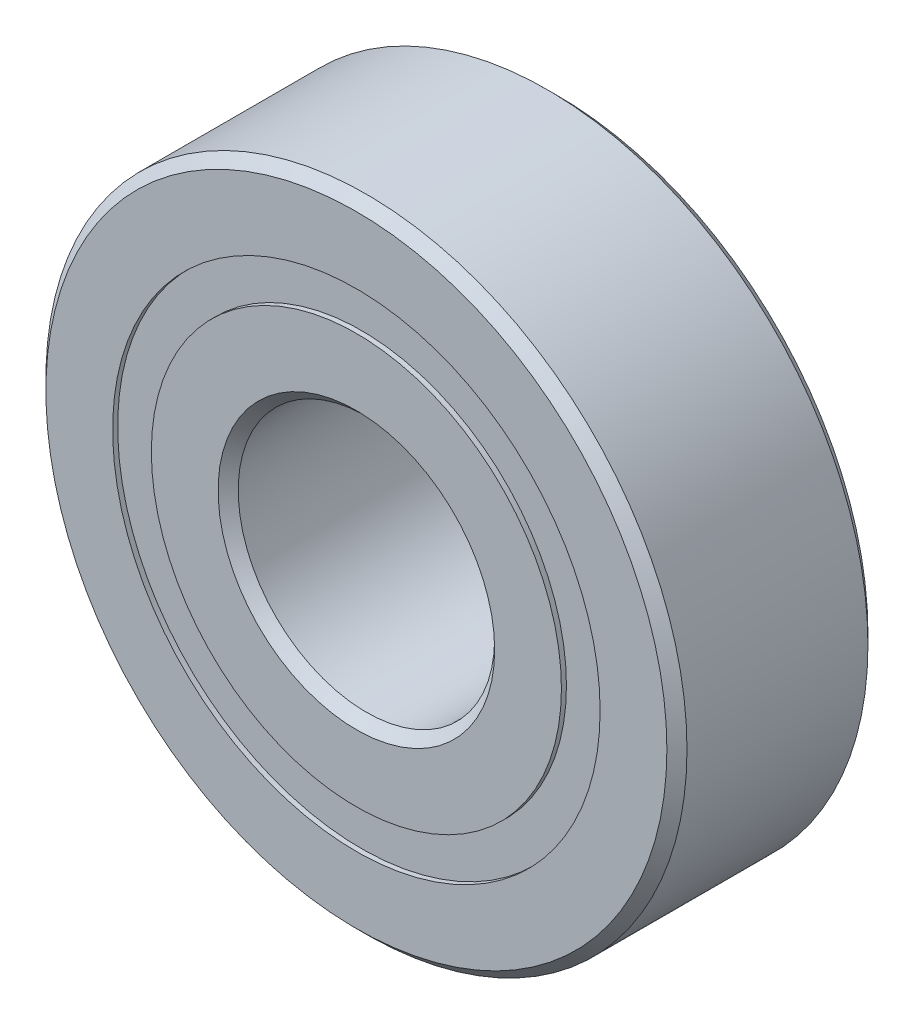
ISO-10303-21;
HEADER;
FILE_DESCRIPTION(('STEP AP214'),'2;1');
FILE_NAME('part.step','',(''),(''),'','','');
FILE_SCHEMA(('AUTOMOTIVE_DESIGN { 1 0 10303 214 1 1 1 1 }'));
ENDSEC;
DATA;
#1=APPLICATION_CONTEXT('core data for automotive mechanical design processes');
#2=APPLICATION_PROTOCOL_DEFINITION('international standard','automotive_design',2000,#1);
#3=PRODUCT_CONTEXT('',#1,'mechanical');
#4=PRODUCT('Part','Part','',(#3));
#5=PRODUCT_RELATED_PRODUCT_CATEGORY('part','',(#4));
#6=PRODUCT_DEFINITION_FORMATION('','',#4);
#7=PRODUCT_DEFINITION_CONTEXT('part definition',#1,'design');
#8=PRODUCT_DEFINITION('design','',#6,#7);
#9=PRODUCT_DEFINITION_SHAPE('','',#8);
#10=(LENGTH_UNIT() NAMED_UNIT(*) SI_UNIT(.MILLI.,.METRE.));
#11=(NAMED_UNIT(*) PLANE_ANGLE_UNIT() SI_UNIT($,.RADIAN.));
#12=(NAMED_UNIT(*) SI_UNIT($,.STERADIAN.) SOLID_ANGLE_UNIT());
#13=UNCERTAINTY_MEASURE_WITH_UNIT(LENGTH_MEASURE(1.E-05),#10,'distance_accuracy_value','');
#14=(GEOMETRIC_REPRESENTATION_CONTEXT(3) GLOBAL_UNCERTAINTY_ASSIGNED_CONTEXT((#13)) GLOBAL_UNIT_ASSIGNED_CONTEXT((#10,
#11,#12)) REPRESENTATION_CONTEXT('',''));
#15=CARTESIAN_POINT('',(0.,0.,0.));
#16=DIRECTION('',(0.,0.,1.));
#17=DIRECTION('',(1.,0.,0.));
#18=AXIS2_PLACEMENT_3D('',#15,#16,#17);
#19=CARTESIAN_POINT('',(0.,6.03522142857143,-2.36474));
#20=DIRECTION('',(0.,0.,1.));
#21=DIRECTION('',(1.,0.,0.));
#22=AXIS2_PLACEMENT_3D('',#19,#20,#21);
#23=PLANE('',#22);
#24=CARTESIAN_POINT('',(0.,0.,-2.36474));
#25=DIRECTION('',(0.,0.,1.));
#26=DIRECTION('',(1.,0.,0.));
#27=AXIS2_PLACEMENT_3D('',#24,#25,#26);
#28=CIRCLE('',#27,6.03522142857143);
#29=CARTESIAN_POINT('',(6.03522142857143,0.,-2.36474));
#30=VERTEX_POINT('',#29);
#31=EDGE_CURVE('E57',#30,#30,#28,.T.);
#32=ORIENTED_EDGE('',*,*,#31,.F.);
#33=EDGE_LOOP('',(#32));
#34=FACE_BOUND('',#33,.T.);
#35=CARTESIAN_POINT('',(0.,0.,-2.36474));
#36=DIRECTION('',(0.,0.,1.));
#37=DIRECTION('',(1.,0.,0.));
#38=AXIS2_PLACEMENT_3D('',#35,#36,#37);
#39=CIRCLE('',#38,5.07727857142857);
#40=CARTESIAN_POINT('',(5.07727857142857,0.,-2.36474));
#41=VERTEX_POINT('',#40);
#42=EDGE_CURVE('E11',#41,#41,#39,.T.);
#43=ORIENTED_EDGE('',*,*,#42,.T.);
#44=EDGE_LOOP('',(#43));
#45=FACE_BOUND('',#44,.T.);
#46=ADVANCED_FACE('F43',(#34,#45),#23,.F.);
#47=CARTESIAN_POINT('',(0.,0.,2.4892));
#48=DIRECTION('',(0.,0.,1.));
#49=DIRECTION('',(1.,0.,0.));
#50=AXIS2_PLACEMENT_3D('',#47,#48,#49);
#51=CYLINDRICAL_SURFACE('',#50,5.07727857142857);
#52=ORIENTED_EDGE('',*,*,#42,.F.);
#53=EDGE_LOOP('',(#52));
#54=FACE_BOUND('',#53,.T.);
#55=CARTESIAN_POINT('',(0.,0.,-1.20554465033679));
#56=DIRECTION('',(0.,0.,1.));
#57=DIRECTION('',(1.,0.,0.));
#58=AXIS2_PLACEMENT_3D('',#55,#56,#57);
#59=CIRCLE('',#58,5.07727857142857);
#60=CARTESIAN_POINT('',(5.07727857142857,0.,-1.20554465033679));
#61=VERTEX_POINT('',#60);
#62=EDGE_CURVE('E49',#61,#61,#59,.T.);
#63=ORIENTED_EDGE('',*,*,#62,.T.);
#64=EDGE_LOOP('',(#63));
#65=FACE_BOUND('',#64,.T.);
#66=ADVANCED_FACE('F66',(#54,#65),#51,.F.);
#67=CARTESIAN_POINT('',(0.,6.03522142857143,-1.20554465033679));
#68=DIRECTION('',(0.,0.,-1.));
#69=DIRECTION('',(-1.,0.,0.));
#70=AXIS2_PLACEMENT_3D('',#67,#68,#69);
#71=PLANE('',#70);
#72=ORIENTED_EDGE('',*,*,#62,.F.);
#73=EDGE_LOOP('',(#72));
#74=FACE_BOUND('',#73,.T.);
#75=CARTESIAN_POINT('',(0.,0.,-1.20554465033679));
#76=DIRECTION('',(0.,0.,1.));
#77=DIRECTION('',(1.,0.,0.));
#78=AXIS2_PLACEMENT_3D('',#75,#76,#77);
#79=CIRCLE('',#78,6.03522142857143);
#80=CARTESIAN_POINT('',(6.03522142857143,0.,-1.20554465033679));
#81=VERTEX_POINT('',#80);
#82=EDGE_CURVE('E53',#81,#81,#79,.T.);
#83=ORIENTED_EDGE('',*,*,#82,.T.);
#84=EDGE_LOOP('',(#83));
#85=FACE_BOUND('',#84,.T.);
#86=ADVANCED_FACE('F70',(#74,#85),#71,.F.);
#87=CARTESIAN_POINT('',(0.,0.,2.4892));
#88=DIRECTION('',(0.,0.,1.));
#89=DIRECTION('',(1.,0.,0.));
#90=AXIS2_PLACEMENT_3D('',#87,#88,#89);
#91=CYLINDRICAL_SURFACE('',#90,6.03522142857143);
#92=ORIENTED_EDGE('',*,*,#82,.F.);
#93=EDGE_LOOP('',(#92));
#94=FACE_BOUND('',#93,.T.);
#95=ORIENTED_EDGE('',*,*,#31,.T.);
#96=EDGE_LOOP('',(#95));
#97=FACE_BOUND('',#96,.T.);
#98=ADVANCED_FACE('F63',(#94,#97),#91,.T.);
#99=CLOSED_SHELL('',(#46,#66,#86,#98));
#100=MANIFOLD_SOLID_BREP('B2',#99);
#101=CARTESIAN_POINT('',(0.,6.03522142857143,2.36474));
#102=DIRECTION('',(0.,0.,-1.));
#103=DIRECTION('',(-1.,0.,0.));
#104=AXIS2_PLACEMENT_3D('',#101,#102,#103);
#105=PLANE('',#104);
#106=CARTESIAN_POINT('',(0.,0.,2.36474));
#107=DIRECTION('',(0.,0.,1.));
#108=DIRECTION('',(1.,0.,0.));
#109=AXIS2_PLACEMENT_3D('',#106,#107,#108);
#110=CIRCLE('',#109,5.07727857142857);
#111=CARTESIAN_POINT('',(5.07727857142857,0.,2.36474));
#112=VERTEX_POINT('',#111);
#113=EDGE_CURVE('E42',#112,#112,#110,.T.);
#114=ORIENTED_EDGE('',*,*,#113,.F.);
#115=EDGE_LOOP('',(#114));
#116=FACE_BOUND('',#115,.T.);
#117=CARTESIAN_POINT('',(0.,0.,2.36474));
#118=DIRECTION('',(0.,0.,1.));
#119=DIRECTION('',(1.,0.,0.));
#120=AXIS2_PLACEMENT_3D('',#117,#118,#119);
#121=CIRCLE('',#120,6.03522142857143);
#122=CARTESIAN_POINT('',(6.03522142857143,0.,2.36474));
#123=VERTEX_POINT('',#122);
#124=EDGE_CURVE('E124',#123,#123,#121,.T.);
#125=ORIENTED_EDGE('',*,*,#124,.T.);
#126=EDGE_LOOP('',(#125));
#127=FACE_BOUND('',#126,.T.);
#128=ADVANCED_FACE('F110',(#116,#127),#105,.F.);
#129=CARTESIAN_POINT('',(0.,0.,2.4892));
#130=DIRECTION('',(0.,0.,1.));
#131=DIRECTION('',(1.,0.,0.));
#132=AXIS2_PLACEMENT_3D('',#129,#130,#131);
#133=CYLINDRICAL_SURFACE('',#132,5.07727857142857);
#134=CARTESIAN_POINT('',(0.,0.,1.20554465033679));
#135=DIRECTION('',(0.,0.,1.));
#136=DIRECTION('',(1.,0.,0.));
#137=AXIS2_PLACEMENT_3D('',#134,#135,#136);
#138=CIRCLE('',#137,5.07727857142857);
#139=CARTESIAN_POINT('',(5.07727857142857,0.,1.20554465033679));
#140=VERTEX_POINT('',#139);
#141=EDGE_CURVE('E116',#140,#140,#138,.T.);
#142=ORIENTED_EDGE('',*,*,#141,.F.);
#143=EDGE_LOOP('',(#142));
#144=FACE_BOUND('',#143,.T.);
#145=ORIENTED_EDGE('',*,*,#113,.T.);
#146=EDGE_LOOP('',(#145));
#147=FACE_BOUND('',#146,.T.);
#148=ADVANCED_FACE('F139',(#144,#147),#133,.F.);
#149=CARTESIAN_POINT('',(0.,6.03522142857143,1.20554465033679));
#150=DIRECTION('',(0.,0.,1.));
#151=DIRECTION('',(1.,0.,0.));
#152=AXIS2_PLACEMENT_3D('',#149,#150,#151);
#153=PLANE('',#152);
#154=CARTESIAN_POINT('',(0.,0.,1.20554465033679));
#155=DIRECTION('',(0.,0.,1.));
#156=DIRECTION('',(1.,0.,0.));
#157=AXIS2_PLACEMENT_3D('',#154,#155,#156);
#158=CIRCLE('',#157,6.03522142857143);
#159=CARTESIAN_POINT('',(6.03522142857143,0.,1.20554465033679));
#160=VERTEX_POINT('',#159);
#161=EDGE_CURVE('E120',#160,#160,#158,.T.);
#162=ORIENTED_EDGE('',*,*,#161,.F.);
#163=EDGE_LOOP('',(#162));
#164=FACE_BOUND('',#163,.T.);
#165=ORIENTED_EDGE('',*,*,#141,.T.);
#166=EDGE_LOOP('',(#165));
#167=FACE_BOUND('',#166,.T.);
#168=ADVANCED_FACE('F134',(#164,#167),#153,.F.);
#169=CARTESIAN_POINT('',(0.,0.,2.4892));
#170=DIRECTION('',(0.,0.,1.));
#171=DIRECTION('',(1.,0.,0.));
#172=AXIS2_PLACEMENT_3D('',#169,#170,#171);
#173=CYLINDRICAL_SURFACE('',#172,6.03522142857143);
#174=ORIENTED_EDGE('',*,*,#124,.F.);
#175=EDGE_LOOP('',(#174));
#176=FACE_BOUND('',#175,.T.);
#177=ORIENTED_EDGE('',*,*,#161,.T.);
#178=EDGE_LOOP('',(#177));
#179=FACE_BOUND('',#178,.T.);
#180=ADVANCED_FACE('F131',(#176,#179),#173,.T.);
#181=CLOSED_SHELL('',(#128,#148,#168,#180));
#182=MANIFOLD_SOLID_BREP('B6',#181);
#183=CARTESIAN_POINT('',(-3.92886205296771,3.9288620529678,0.));
#184=DIRECTION('',(0.,0.,1.));
#185=DIRECTION('',(-0.707106781186539,0.707106781186556,0.));
#186=AXIS2_PLACEMENT_3D('',#183,#184,#185);
#187=SPHERICAL_SURFACE('',#186,1.20554465033679);
#188=CARTESIAN_POINT('',(-3.92886205296771,3.9288620529678,1.20554465033679));
#189=VERTEX_POINT('',#188);
#190=VERTEX_LOOP('',#189);
#191=FACE_BOUND('',#190,.T.);
#192=ADVANCED_FACE('F177',(#191),#187,.T.);
#193=CLOSED_SHELL('',(#192));
#194=MANIFOLD_SOLID_BREP('B37',#193);
#195=CARTESIAN_POINT('',(-5.55625,0.,0.));
#196=DIRECTION('',(0.,0.,1.));
#197=DIRECTION('',(-1.,0.,0.));
#198=AXIS2_PLACEMENT_3D('',#195,#196,#197);
#199=SPHERICAL_SURFACE('',#198,1.20554465033679);
#200=CARTESIAN_POINT('',(-5.55625,0.,1.20554465033679));
#201=VERTEX_POINT('',#200);
#202=VERTEX_LOOP('',#201);
#203=FACE_BOUND('',#202,.T.);
#204=ADVANCED_FACE('F197',(#203),#199,.T.);
#205=CLOSED_SHELL('',(#204));
#206=MANIFOLD_SOLID_BREP('B106',#205);
#207=CARTESIAN_POINT('',(-3.92886205296779,-3.92886205296772,0.));
#208=DIRECTION('',(0.,0.,1.));
#209=DIRECTION('',(-0.707106781186554,-0.707106781186541,0.));
#210=AXIS2_PLACEMENT_3D('',#207,#208,#209);
#211=SPHERICAL_SURFACE('',#210,1.20554465033679);
#212=CARTESIAN_POINT('',(-3.92886205296779,-3.92886205296772,1.20554465033679));
#213=VERTEX_POINT('',#212);
#214=VERTEX_LOOP('',#213);
#215=FACE_BOUND('',#214,.T.);
#216=ADVANCED_FACE('F217',(#215),#211,.T.);
#217=CLOSED_SHELL('',(#216));
#218=MANIFOLD_SOLID_BREP('B173',#217);
#219=CARTESIAN_POINT('',(0.,-5.55625,0.));
#220=DIRECTION('',(0.,0.,1.));
#221=DIRECTION('',(0.,-1.,0.));
#222=AXIS2_PLACEMENT_3D('',#219,#220,#221);
#223=SPHERICAL_SURFACE('',#222,1.20554465033679);
#224=CARTESIAN_POINT('',(0.,-5.55625,1.20554465033679));
#225=VERTEX_POINT('',#224);
#226=VERTEX_LOOP('',#225);
#227=FACE_BOUND('',#226,.T.);
#228=ADVANCED_FACE('F237',(#227),#223,.T.);
#229=CLOSED_SHELL('',(#228));
#230=MANIFOLD_SOLID_BREP('B193',#229);
#231=CARTESIAN_POINT('',(3.92886205296773,-3.92886205296778,0.));
#232=DIRECTION('',(0.,0.,1.));
#233=DIRECTION('',(0.707106781186544,-0.707106781186551,0.));
#234=AXIS2_PLACEMENT_3D('',#231,#232,#233);
#235=SPHERICAL_SURFACE('',#234,1.20554465033679);
#236=CARTESIAN_POINT('',(3.92886205296773,-3.92886205296778,1.20554465033679));
#237=VERTEX_POINT('',#236);
#238=VERTEX_LOOP('',#237);
#239=FACE_BOUND('',#238,.T.);
#240=ADVANCED_FACE('F257',(#239),#235,.T.);
#241=CLOSED_SHELL('',(#240));
#242=MANIFOLD_SOLID_BREP('B213',#241);
#243=CARTESIAN_POINT('',(5.55625,0.,0.));
#244=DIRECTION('',(0.,0.,1.));
#245=DIRECTION('',(1.,0.,0.));
#246=AXIS2_PLACEMENT_3D('',#243,#244,#245);
#247=SPHERICAL_SURFACE('',#246,1.20554465033679);
#248=CARTESIAN_POINT('',(5.55625,0.,1.20554465033679));
#249=VERTEX_POINT('',#248);
#250=VERTEX_LOOP('',#249);
#251=FACE_BOUND('',#250,.T.);
#252=ADVANCED_FACE('F277',(#251),#247,.T.);
#253=CLOSED_SHELL('',(#252));
#254=MANIFOLD_SOLID_BREP('B233',#253);
#255=CARTESIAN_POINT('',(3.92886205296776,3.92886205296775,0.));
#256=DIRECTION('',(0.,0.,1.));
#257=DIRECTION('',(0.707106781186549,0.707106781186546,0.));
#258=AXIS2_PLACEMENT_3D('',#255,#256,#257);
#259=SPHERICAL_SURFACE('',#258,1.20554465033679);
#260=CARTESIAN_POINT('',(3.92886205296776,3.92886205296775,1.20554465033679));
#261=VERTEX_POINT('',#260);
#262=VERTEX_LOOP('',#261);
#263=FACE_BOUND('',#262,.T.);
#264=ADVANCED_FACE('F297',(#263),#259,.T.);
#265=CLOSED_SHELL('',(#264));
#266=MANIFOLD_SOLID_BREP('B253',#265);
#267=CARTESIAN_POINT('',(0.,5.55625,0.));
#268=DIRECTION('',(0.,0.,1.));
#269=DIRECTION('',(0.,1.,0.));
#270=AXIS2_PLACEMENT_3D('',#267,#268,#269);
#271=SPHERICAL_SURFACE('',#270,1.20554465033679);
#272=CARTESIAN_POINT('',(0.,5.55625,1.20554465033679));
#273=VERTEX_POINT('',#272);
#274=VERTEX_LOOP('',#273);
#275=FACE_BOUND('',#274,.T.);
#276=ADVANCED_FACE('F319',(#275),#271,.T.);
#277=CLOSED_SHELL('',(#276));
#278=MANIFOLD_SOLID_BREP('B273',#277);
#279=CARTESIAN_POINT('',(0.,5.07727857142857,2.4892));
#280=DIRECTION('',(0.,0.,-1.));
#281=DIRECTION('',(-1.,0.,0.));
#282=AXIS2_PLACEMENT_3D('',#279,#280,#281);
#283=PLANE('',#282);
#284=CARTESIAN_POINT('',(0.,0.,2.4892));
#285=DIRECTION('',(0.,0.,1.));
#286=DIRECTION('',(1.,0.,0.));
#287=AXIS2_PLACEMENT_3D('',#284,#285,#286);
#288=CIRCLE('',#287,3.42392);
#289=CARTESIAN_POINT('',(3.42392,0.,2.4892));
#290=VERTEX_POINT('',#289);
#291=EDGE_CURVE('E366',#290,#290,#288,.T.);
#292=ORIENTED_EDGE('',*,*,#291,.F.);
#293=EDGE_LOOP('',(#292));
#294=FACE_BOUND('',#293,.T.);
#295=CARTESIAN_POINT('',(0.,0.,2.4892));
#296=DIRECTION('',(0.,0.,1.));
#297=DIRECTION('',(1.,0.,0.));
#298=AXIS2_PLACEMENT_3D('',#295,#296,#297);
#299=CIRCLE('',#298,5.07727857142857);
#300=CARTESIAN_POINT('',(5.07727857142857,0.,2.4892));
#301=VERTEX_POINT('',#300);
#302=EDGE_CURVE('E318',#301,#301,#299,.T.);
#303=ORIENTED_EDGE('',*,*,#302,.T.);
#304=EDGE_LOOP('',(#303));
#305=FACE_BOUND('',#304,.T.);
#306=ADVANCED_FACE('F338',(#294,#305),#283,.F.);
#307=CARTESIAN_POINT('',(0.,0.,2.4892));
#308=DIRECTION('',(0.,0.,1.));
#309=DIRECTION('',(1.,0.,0.));
#310=AXIS2_PLACEMENT_3D('',#307,#308,#309);
#311=CYLINDRICAL_SURFACE('',#310,5.07727857142857);
#312=ORIENTED_EDGE('',*,*,#302,.F.);
#313=EDGE_LOOP('',(#312));
#314=FACE_BOUND('',#313,.T.);
#315=CARTESIAN_POINT('',(0.,0.,1.10631111111111));
#316=DIRECTION('',(0.,0.,1.));
#317=DIRECTION('',(1.,0.,0.));
#318=AXIS2_PLACEMENT_3D('',#315,#316,#317);
#319=CIRCLE('',#318,5.07727857142857);
#320=CARTESIAN_POINT('',(5.07727857142857,0.,1.10631111111111));
#321=VERTEX_POINT('',#320);
#322=EDGE_CURVE('E344',#321,#321,#319,.T.);
#323=ORIENTED_EDGE('',*,*,#322,.T.);
#324=EDGE_LOOP('',(#323));
#325=FACE_BOUND('',#324,.T.);
#326=ADVANCED_FACE('F373',(#314,#325),#311,.T.);
#327=CARTESIAN_POINT('',(0.,0.,0.));
#328=DIRECTION('',(0.,0.,1.));
#329=DIRECTION('',(1.,0.,0.));
#330=AXIS2_PLACEMENT_3D('',#327,#328,#329);
#331=TOROIDAL_SURFACE('',#330,5.55625,1.20554465033679);
#332=ORIENTED_EDGE('',*,*,#322,.F.);
#333=EDGE_LOOP('',(#332));
#334=FACE_BOUND('',#333,.T.);
#335=CARTESIAN_POINT('',(0.,0.,-1.10631111111111));
#336=DIRECTION('',(0.,0.,1.));
#337=DIRECTION('',(1.,0.,0.));
#338=AXIS2_PLACEMENT_3D('',#335,#336,#337);
#339=CIRCLE('',#338,5.07727857142857);
#340=CARTESIAN_POINT('',(5.07727857142857,0.,-1.10631111111111));
#341=VERTEX_POINT('',#340);
#342=EDGE_CURVE('E348',#341,#341,#339,.T.);
#343=ORIENTED_EDGE('',*,*,#342,.T.);
#344=EDGE_LOOP('',(#343));
#345=FACE_BOUND('',#344,.T.);
#346=ADVANCED_FACE('F377',(#334,#345),#331,.F.);
#347=CARTESIAN_POINT('',(0.,0.,2.4892));
#348=DIRECTION('',(0.,0.,1.));
#349=DIRECTION('',(1.,0.,0.));
#350=AXIS2_PLACEMENT_3D('',#347,#348,#349);
#351=CYLINDRICAL_SURFACE('',#350,5.07727857142857);
#352=ORIENTED_EDGE('',*,*,#342,.F.);
#353=EDGE_LOOP('',(#352));
#354=FACE_BOUND('',#353,.T.);
#355=CARTESIAN_POINT('',(0.,0.,-2.4892));
#356=DIRECTION('',(0.,0.,1.));
#357=DIRECTION('',(1.,0.,0.));
#358=AXIS2_PLACEMENT_3D('',#355,#356,#357);
#359=CIRCLE('',#358,5.07727857142857);
#360=CARTESIAN_POINT('',(5.07727857142857,0.,-2.4892));
#361=VERTEX_POINT('',#360);
#362=EDGE_CURVE('E352',#361,#361,#359,.T.);
#363=ORIENTED_EDGE('',*,*,#362,.T.);
#364=EDGE_LOOP('',(#363));
#365=FACE_BOUND('',#364,.T.);
#366=ADVANCED_FACE('F382',(#354,#365),#351,.T.);
#367=CARTESIAN_POINT('',(0.,3.42392,-2.4892));
#368=DIRECTION('',(0.,0.,1.));
#369=DIRECTION('',(1.,0.,0.));
#370=AXIS2_PLACEMENT_3D('',#367,#368,#369);
#371=PLANE('',#370);
#372=ORIENTED_EDGE('',*,*,#362,.F.);
#373=EDGE_LOOP('',(#372));
#374=FACE_BOUND('',#373,.T.);
#375=CARTESIAN_POINT('',(0.,0.,-2.4892));
#376=DIRECTION('',(0.,0.,1.));
#377=DIRECTION('',(1.,0.,0.));
#378=AXIS2_PLACEMENT_3D('',#375,#376,#377);
#379=CIRCLE('',#378,3.42392);
#380=CARTESIAN_POINT('',(3.42392,0.,-2.4892));
#381=VERTEX_POINT('',#380);
#382=EDGE_CURVE('E357',#381,#381,#379,.T.);
#383=ORIENTED_EDGE('',*,*,#382,.T.);
#384=EDGE_LOOP('',(#383));
#385=FACE_BOUND('',#384,.T.);
#386=ADVANCED_FACE('F388',(#374,#385),#371,.F.);
#387=CARTESIAN_POINT('',(0.,0.,-2.24028));
#388=DIRECTION('',(0.,0.,-1.));
#389=DIRECTION('',(-1.,0.,0.));
#390=AXIS2_PLACEMENT_3D('',#387,#388,#389);
#391=CONICAL_SURFACE('',#390,3.175,0.785398163397447);
#392=ORIENTED_EDGE('',*,*,#382,.F.);
#393=EDGE_LOOP('',(#392));
#394=FACE_BOUND('',#393,.T.);
#395=CARTESIAN_POINT('',(0.,0.,-2.24028));
#396=DIRECTION('',(0.,0.,1.));
#397=DIRECTION('',(1.,0.,0.));
#398=AXIS2_PLACEMENT_3D('',#395,#396,#397);
#399=CIRCLE('',#398,3.175);
#400=CARTESIAN_POINT('',(3.175,0.,-2.24028));
#401=VERTEX_POINT('',#400);
#402=EDGE_CURVE('E360',#401,#401,#399,.T.);
#403=ORIENTED_EDGE('',*,*,#402,.T.);
#404=EDGE_LOOP('',(#403));
#405=FACE_BOUND('',#404,.T.);
#406=ADVANCED_FACE('F392',(#394,#405),#391,.F.);
#407=CARTESIAN_POINT('',(0.,0.,2.4892));
#408=DIRECTION('',(0.,0.,1.));
#409=DIRECTION('',(1.,0.,0.));
#410=AXIS2_PLACEMENT_3D('',#407,#408,#409);
#411=CYLINDRICAL_SURFACE('',#410,3.175);
#412=ORIENTED_EDGE('',*,*,#402,.F.);
#413=EDGE_LOOP('',(#412));
#414=FACE_BOUND('',#413,.T.);
#415=CARTESIAN_POINT('',(0.,0.,2.24028));
#416=DIRECTION('',(0.,0.,1.));
#417=DIRECTION('',(1.,0.,0.));
#418=AXIS2_PLACEMENT_3D('',#415,#416,#417);
#419=CIRCLE('',#418,3.175);
#420=CARTESIAN_POINT('',(3.175,0.,2.24028));
#421=VERTEX_POINT('',#420);
#422=EDGE_CURVE('E363',#421,#421,#419,.T.);
#423=ORIENTED_EDGE('',*,*,#422,.T.);
#424=EDGE_LOOP('',(#423));
#425=FACE_BOUND('',#424,.T.);
#426=ADVANCED_FACE('F396',(#414,#425),#411,.F.);
#427=CARTESIAN_POINT('',(0.,0.,2.4892));
#428=DIRECTION('',(0.,0.,1.));
#429=DIRECTION('',(1.,0.,0.));
#430=AXIS2_PLACEMENT_3D('',#427,#428,#429);
#431=CONICAL_SURFACE('',#430,3.42392,0.785398163397453);
#432=ORIENTED_EDGE('',*,*,#422,.F.);
#433=EDGE_LOOP('',(#432));
#434=FACE_BOUND('',#433,.T.);
#435=ORIENTED_EDGE('',*,*,#291,.T.);
#436=EDGE_LOOP('',(#435));
#437=FACE_BOUND('',#436,.T.);
#438=ADVANCED_FACE('F370',(#434,#437),#431,.F.);
#439=CLOSED_SHELL('',(#306,#326,#346,#366,#386,#406,#426,#438));
#440=MANIFOLD_SOLID_BREP('B293',#439);
#441=CARTESIAN_POINT('',(0.,0.,2.24028));
#442=DIRECTION('',(0.,0.,-1.));
#443=DIRECTION('',(-1.,0.,0.));
#444=AXIS2_PLACEMENT_3D('',#441,#442,#443);
#445=CONICAL_SURFACE('',#444,7.9375,0.785398163397447);
#446=CARTESIAN_POINT('',(0.,0.,2.4892));
#447=DIRECTION('',(0.,0.,1.));
#448=DIRECTION('',(1.,0.,0.));
#449=AXIS2_PLACEMENT_3D('',#446,#447,#448);
#450=CIRCLE('',#449,7.68858);
#451=CARTESIAN_POINT('',(7.68858,0.,2.4892));
#452=VERTEX_POINT('',#451);
#453=EDGE_CURVE('E487',#452,#452,#450,.T.);
#454=ORIENTED_EDGE('',*,*,#453,.F.);
#455=EDGE_LOOP('',(#454));
#456=FACE_BOUND('',#455,.T.);
#457=CARTESIAN_POINT('',(0.,0.,2.24028));
#458=DIRECTION('',(0.,0.,1.));
#459=DIRECTION('',(1.,0.,0.));
#460=AXIS2_PLACEMENT_3D('',#457,#458,#459);
#461=CIRCLE('',#460,7.9375);
#462=CARTESIAN_POINT('',(7.9375,0.,2.24028));
#463=VERTEX_POINT('',#462);
#464=EDGE_CURVE('E337',#463,#463,#461,.T.);
#465=ORIENTED_EDGE('',*,*,#464,.T.);
#466=EDGE_LOOP('',(#465));
#467=FACE_BOUND('',#466,.T.);
#468=ADVANCED_FACE('F459',(#456,#467),#445,.T.);
#469=CARTESIAN_POINT('',(0.,0.,2.4892));
#470=DIRECTION('',(0.,0.,1.));
#471=DIRECTION('',(1.,0.,0.));
#472=AXIS2_PLACEMENT_3D('',#469,#470,#471);
#473=CYLINDRICAL_SURFACE('',#472,7.9375);
#474=ORIENTED_EDGE('',*,*,#464,.F.);
#475=EDGE_LOOP('',(#474));
#476=FACE_BOUND('',#475,.T.);
#477=CARTESIAN_POINT('',(0.,0.,-2.24028));
#478=DIRECTION('',(0.,0.,1.));
#479=DIRECTION('',(1.,0.,0.));
#480=AXIS2_PLACEMENT_3D('',#477,#478,#479);
#481=CIRCLE('',#480,7.9375);
#482=CARTESIAN_POINT('',(7.9375,0.,-2.24028));
#483=VERTEX_POINT('',#482);
#484=EDGE_CURVE('E465',#483,#483,#481,.T.);
#485=ORIENTED_EDGE('',*,*,#484,.T.);
#486=EDGE_LOOP('',(#485));
#487=FACE_BOUND('',#486,.T.);
#488=ADVANCED_FACE('F494',(#476,#487),#473,.T.);
#489=CARTESIAN_POINT('',(0.,0.,-2.4892));
#490=DIRECTION('',(0.,0.,1.));
#491=DIRECTION('',(1.,0.,0.));
#492=AXIS2_PLACEMENT_3D('',#489,#490,#491);
#493=CONICAL_SURFACE('',#492,7.68858,0.785398163397447);
#494=ORIENTED_EDGE('',*,*,#484,.F.);
#495=EDGE_LOOP('',(#494));
#496=FACE_BOUND('',#495,.T.);
#497=CARTESIAN_POINT('',(0.,0.,-2.4892));
#498=DIRECTION('',(0.,0.,1.));
#499=DIRECTION('',(1.,0.,0.));
#500=AXIS2_PLACEMENT_3D('',#497,#498,#499);
#501=CIRCLE('',#500,7.68858);
#502=CARTESIAN_POINT('',(7.68858,0.,-2.4892));
#503=VERTEX_POINT('',#502);
#504=EDGE_CURVE('E469',#503,#503,#501,.T.);
#505=ORIENTED_EDGE('',*,*,#504,.T.);
#506=EDGE_LOOP('',(#505));
#507=FACE_BOUND('',#506,.T.);
#508=ADVANCED_FACE('F498',(#496,#507),#493,.T.);
#509=CARTESIAN_POINT('',(0.,7.68858,-2.4892));
#510=DIRECTION('',(0.,0.,1.));
#511=DIRECTION('',(1.,0.,0.));
#512=AXIS2_PLACEMENT_3D('',#509,#510,#511);
#513=PLANE('',#512);
#514=ORIENTED_EDGE('',*,*,#504,.F.);
#515=EDGE_LOOP('',(#514));
#516=FACE_BOUND('',#515,.T.);
#517=CARTESIAN_POINT('',(0.,0.,-2.4892));
#518=DIRECTION('',(0.,0.,1.));
#519=DIRECTION('',(1.,0.,0.));
#520=AXIS2_PLACEMENT_3D('',#517,#518,#519);
#521=CIRCLE('',#520,6.03522142857143);
#522=CARTESIAN_POINT('',(6.03522142857143,0.,-2.4892));
#523=VERTEX_POINT('',#522);
#524=EDGE_CURVE('E473',#523,#523,#521,.T.);
#525=ORIENTED_EDGE('',*,*,#524,.T.);
#526=EDGE_LOOP('',(#525));
#527=FACE_BOUND('',#526,.T.);
#528=ADVANCED_FACE('F503',(#516,#527),#513,.F.);
#529=CARTESIAN_POINT('',(0.,0.,2.4892));
#530=DIRECTION('',(0.,0.,1.));
#531=DIRECTION('',(1.,0.,0.));
#532=AXIS2_PLACEMENT_3D('',#529,#530,#531);
#533=CYLINDRICAL_SURFACE('',#532,6.03522142857143);
#534=ORIENTED_EDGE('',*,*,#524,.F.);
#535=EDGE_LOOP('',(#534));
#536=FACE_BOUND('',#535,.T.);
#537=CARTESIAN_POINT('',(0.,0.,-1.10631111111111));
#538=DIRECTION('',(0.,0.,1.));
#539=DIRECTION('',(1.,0.,0.));
#540=AXIS2_PLACEMENT_3D('',#537,#538,#539);
#541=CIRCLE('',#540,6.03522142857143);
#542=CARTESIAN_POINT('',(6.03522142857143,0.,-1.10631111111111));
#543=VERTEX_POINT('',#542);
#544=EDGE_CURVE('E478',#543,#543,#541,.T.);
#545=ORIENTED_EDGE('',*,*,#544,.T.);
#546=EDGE_LOOP('',(#545));
#547=FACE_BOUND('',#546,.T.);
#548=ADVANCED_FACE('F509',(#536,#547),#533,.F.);
#549=CARTESIAN_POINT('',(0.,0.,0.));
#550=DIRECTION('',(0.,0.,1.));
#551=DIRECTION('',(1.,0.,0.));
#552=AXIS2_PLACEMENT_3D('',#549,#550,#551);
#553=TOROIDAL_SURFACE('',#552,5.55625,1.20554465033679);
#554=ORIENTED_EDGE('',*,*,#544,.F.);
#555=EDGE_LOOP('',(#554));
#556=FACE_BOUND('',#555,.T.);
#557=CARTESIAN_POINT('',(0.,0.,1.10631111111111));
#558=DIRECTION('',(0.,0.,1.));
#559=DIRECTION('',(1.,0.,0.));
#560=AXIS2_PLACEMENT_3D('',#557,#558,#559);
#561=CIRCLE('',#560,6.03522142857143);
#562=CARTESIAN_POINT('',(6.03522142857143,0.,1.10631111111111));
#563=VERTEX_POINT('',#562);
#564=EDGE_CURVE('E481',#563,#563,#561,.T.);
#565=ORIENTED_EDGE('',*,*,#564,.T.);
#566=EDGE_LOOP('',(#565));
#567=FACE_BOUND('',#566,.T.);
#568=ADVANCED_FACE('F513',(#556,#567),#553,.F.);
#569=CARTESIAN_POINT('',(0.,0.,2.4892));
#570=DIRECTION('',(0.,0.,1.));
#571=DIRECTION('',(1.,0.,0.));
#572=AXIS2_PLACEMENT_3D('',#569,#570,#571);
#573=CYLINDRICAL_SURFACE('',#572,6.03522142857143);
#574=ORIENTED_EDGE('',*,*,#564,.F.);
#575=EDGE_LOOP('',(#574));
#576=FACE_BOUND('',#575,.T.);
#577=CARTESIAN_POINT('',(0.,0.,2.4892));
#578=DIRECTION('',(0.,0.,1.));
#579=DIRECTION('',(1.,0.,0.));
#580=AXIS2_PLACEMENT_3D('',#577,#578,#579);
#581=CIRCLE('',#580,6.03522142857143);
#582=CARTESIAN_POINT('',(6.03522142857143,0.,2.4892));
#583=VERTEX_POINT('',#582);
#584=EDGE_CURVE('E484',#583,#583,#581,.T.);
#585=ORIENTED_EDGE('',*,*,#584,.T.);
#586=EDGE_LOOP('',(#585));
#587=FACE_BOUND('',#586,.T.);
#588=ADVANCED_FACE('F517',(#576,#587),#573,.F.);
#589=CARTESIAN_POINT('',(0.,7.68858,2.4892));
#590=DIRECTION('',(0.,0.,-1.));
#591=DIRECTION('',(-1.,0.,0.));
#592=AXIS2_PLACEMENT_3D('',#589,#590,#591);
#593=PLANE('',#592);
#594=ORIENTED_EDGE('',*,*,#584,.F.);
#595=EDGE_LOOP('',(#594));
#596=FACE_BOUND('',#595,.T.);
#597=ORIENTED_EDGE('',*,*,#453,.T.);
#598=EDGE_LOOP('',(#597));
#599=FACE_BOUND('',#598,.T.);
#600=ADVANCED_FACE('F491',(#596,#599),#593,.F.);
#601=CLOSED_SHELL('',(#468,#488,#508,#528,#548,#568,#588,#600));
#602=MANIFOLD_SOLID_BREP('B313',#601);
#603=ADVANCED_BREP_SHAPE_REPRESENTATION('',(#18,#100,#182,#194,#206,#218,#230,#242,#254,#266,
#278,#440,#602),#14);
#604=SHAPE_DEFINITION_REPRESENTATION(#9,#603);
ENDSEC;
END-ISO-10303-21;
